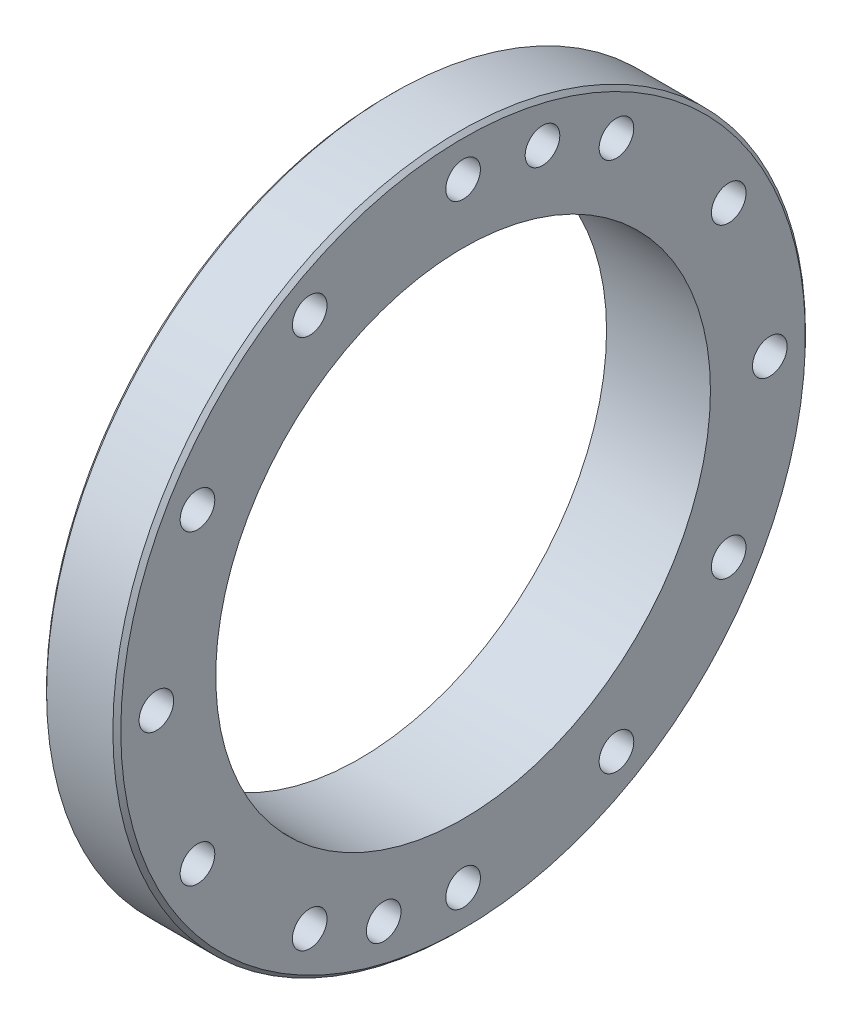
ISO-10303-21;
HEADER;
FILE_DESCRIPTION(('STEP AP214'),'2;1');
FILE_NAME('part.step','',(''),(''),'','','');
FILE_SCHEMA(('AUTOMOTIVE_DESIGN { 1 0 10303 214 1 1 1 1 }'));
ENDSEC;
DATA;
#1=APPLICATION_CONTEXT('core data for automotive mechanical design processes');
#2=APPLICATION_PROTOCOL_DEFINITION('international standard','automotive_design',2000,#1);
#3=PRODUCT_CONTEXT('',#1,'mechanical');
#4=PRODUCT('Part','Part','',(#3));
#5=PRODUCT_RELATED_PRODUCT_CATEGORY('part','',(#4));
#6=PRODUCT_DEFINITION_FORMATION('','',#4);
#7=PRODUCT_DEFINITION_CONTEXT('part definition',#1,'design');
#8=PRODUCT_DEFINITION('design','',#6,#7);
#9=PRODUCT_DEFINITION_SHAPE('','',#8);
#10=(LENGTH_UNIT() NAMED_UNIT(*) SI_UNIT(.MILLI.,.METRE.));
#11=(NAMED_UNIT(*) PLANE_ANGLE_UNIT() SI_UNIT($,.RADIAN.));
#12=(NAMED_UNIT(*) SI_UNIT($,.STERADIAN.) SOLID_ANGLE_UNIT());
#13=UNCERTAINTY_MEASURE_WITH_UNIT(LENGTH_MEASURE(1.E-05),#10,'distance_accuracy_value','');
#14=(GEOMETRIC_REPRESENTATION_CONTEXT(3) GLOBAL_UNCERTAINTY_ASSIGNED_CONTEXT((#13)) GLOBAL_UNIT_ASSIGNED_CONTEXT((#10,
#11,#12)) REPRESENTATION_CONTEXT('',''));
#15=CARTESIAN_POINT('',(0.,0.,0.));
#16=DIRECTION('',(0.,0.,1.));
#17=DIRECTION('',(1.,0.,0.));
#18=AXIS2_PLACEMENT_3D('',#15,#16,#17);
#19=CARTESIAN_POINT('',(19.894500543626,0.,0.));
#20=DIRECTION('',(1.,0.,0.));
#21=DIRECTION('',(0.,0.,-1.));
#22=AXIS2_PLACEMENT_3D('',#19,#20,#21);
#23=CYLINDRICAL_SURFACE('',#22,27.0000000000001);
#24=CARTESIAN_POINT('',(-0.300000000000002,0.,0.));
#25=DIRECTION('',(-1.,0.,0.));
#26=DIRECTION('',(0.,0.,1.));
#27=AXIS2_PLACEMENT_3D('',#24,#25,#26);
#28=CIRCLE('',#27,27.);
#29=CARTESIAN_POINT('',(-0.300000000000002,0.,27.));
#30=VERTEX_POINT('',#29);
#31=EDGE_CURVE('E111',#30,#30,#28,.T.);
#32=ORIENTED_EDGE('',*,*,#31,.T.);
#33=EDGE_LOOP('',(#32));
#34=FACE_BOUND('',#33,.T.);
#35=CARTESIAN_POINT('',(-2.59999999999996,0.,0.));
#36=DIRECTION('',(1.,0.,0.));
#37=DIRECTION('',(0.,0.,-1.));
#38=AXIS2_PLACEMENT_3D('',#35,#36,#37);
#39=CIRCLE('',#38,27.0000000000001);
#40=CARTESIAN_POINT('',(-2.59999999999996,0.,-27.0000000000001));
#41=VERTEX_POINT('',#40);
#42=EDGE_CURVE('E108',#41,#41,#39,.F.);
#43=ORIENTED_EDGE('',*,*,#42,.F.);
#44=EDGE_LOOP('',(#43));
#45=FACE_BOUND('',#44,.T.);
#46=ADVANCED_FACE('F16',(#34,#45),#23,.T.);
#47=CARTESIAN_POINT('',(7.49999999999934,-29.9437006149611,8.02339039817816));
#48=DIRECTION('',(1.,0.,0.));
#49=DIRECTION('',(0.,0.,-1.));
#50=AXIS2_PLACEMENT_3D('',#47,#48,#49);
#51=CYLINDRICAL_SURFACE('',#50,1.24999999999999);
#52=CARTESIAN_POINT('',(0.,-29.9437006149611,8.02339039817816));
#53=DIRECTION('',(1.,0.,0.));
#54=DIRECTION('',(0.,0.,-1.));
#55=AXIS2_PLACEMENT_3D('',#52,#53,#54);
#56=CIRCLE('',#55,1.24999999999999);
#57=CARTESIAN_POINT('',(0.,-29.9437006149611,6.77339039817817));
#58=VERTEX_POINT('',#57);
#59=EDGE_CURVE('E104',#58,#58,#56,.T.);
#60=ORIENTED_EDGE('',*,*,#59,.F.);
#61=EDGE_LOOP('',(#60));
#62=FACE_BOUND('',#61,.T.);
#63=CARTESIAN_POINT('',(3.6995696905251,-29.9437006149611,8.02339039817816));
#64=DIRECTION('',(1.,0.,0.));
#65=DIRECTION('',(0.,0.,-1.));
#66=AXIS2_PLACEMENT_3D('',#63,#64,#65);
#67=CIRCLE('',#66,1.25000000006885);
#68=CARTESIAN_POINT('',(3.6995696905251,-29.9437006149611,6.77339039810931));
#69=VERTEX_POINT('',#68);
#70=EDGE_CURVE('E105',#69,#69,#67,.T.);
#71=ORIENTED_EDGE('',*,*,#70,.T.);
#72=EDGE_LOOP('',(#71));
#73=FACE_BOUND('',#72,.T.);
#74=ADVANCED_FACE('F210',(#62,#73),#51,.F.);
#75=CARTESIAN_POINT('',(7.49999999999934,29.9437006149611,-8.02339039817816));
#76=DIRECTION('',(1.,0.,0.));
#77=DIRECTION('',(0.,0.,-1.));
#78=AXIS2_PLACEMENT_3D('',#75,#76,#77);
#79=CYLINDRICAL_SURFACE('',#78,1.24999999999999);
#80=CARTESIAN_POINT('',(0.,29.9437006149611,-8.02339039817816));
#81=DIRECTION('',(1.,0.,0.));
#82=DIRECTION('',(0.,0.,-1.));
#83=AXIS2_PLACEMENT_3D('',#80,#81,#82);
#84=CIRCLE('',#83,1.24999999999999);
#85=CARTESIAN_POINT('',(0.,29.9437006149611,-9.27339039817815));
#86=VERTEX_POINT('',#85);
#87=EDGE_CURVE('E204',#86,#86,#84,.T.);
#88=ORIENTED_EDGE('',*,*,#87,.F.);
#89=EDGE_LOOP('',(#88));
#90=FACE_BOUND('',#89,.T.);
#91=CARTESIAN_POINT('',(3.6995696905251,29.9437006149611,-8.02339039817816));
#92=DIRECTION('',(1.,0.,0.));
#93=DIRECTION('',(0.,0.,-1.));
#94=AXIS2_PLACEMENT_3D('',#91,#92,#93);
#95=CIRCLE('',#94,1.24999999998572);
#96=CARTESIAN_POINT('',(3.6995696905251,29.9437006149611,-9.27339039816388));
#97=VERTEX_POINT('',#96);
#98=EDGE_CURVE('E96',#97,#97,#95,.T.);
#99=ORIENTED_EDGE('',*,*,#98,.T.);
#100=EDGE_LOOP('',(#99));
#101=FACE_BOUND('',#100,.T.);
#102=ADVANCED_FACE('F87',(#90,#101),#79,.F.);
#103=CARTESIAN_POINT('',(-0.300000000000002,0.,0.));
#104=DIRECTION('',(-1.,0.,0.));
#105=DIRECTION('',(0.,0.,1.));
#106=AXIS2_PLACEMENT_3D('',#103,#104,#105);
#107=TOROIDAL_SURFACE('',#106,27.3000000000001,0.3);
#108=ORIENTED_EDGE('',*,*,#31,.F.);
#109=EDGE_LOOP('',(#108));
#110=FACE_BOUND('',#109,.T.);
#111=CARTESIAN_POINT('',(0.,0.,0.));
#112=DIRECTION('',(-1.,0.,0.));
#113=DIRECTION('',(0.,0.,-1.));
#114=AXIS2_PLACEMENT_3D('',#111,#112,#113);
#115=CIRCLE('',#114,27.3000000000001);
#116=CARTESIAN_POINT('',(0.,0.,27.3000000000001));
#117=VERTEX_POINT('',#116);
#118=CARTESIAN_POINT('',(0.,0.,-27.3000000000001));
#119=VERTEX_POINT('',#118);
#120=EDGE_CURVE('E36',#117,#119,#115,.F.);
#121=ORIENTED_EDGE('',*,*,#120,.F.);
#122=CARTESIAN_POINT('',(0.,0.,0.));
#123=DIRECTION('',(-1.,0.,0.));
#124=DIRECTION('',(0.,0.,1.));
#125=AXIS2_PLACEMENT_3D('',#122,#123,#124);
#126=CIRCLE('',#125,27.3000000000001);
#127=EDGE_CURVE('E33',#119,#117,#126,.F.);
#128=ORIENTED_EDGE('',*,*,#127,.F.);
#129=EDGE_LOOP('',(#121,#128));
#130=FACE_BOUND('',#129,.T.);
#131=ADVANCED_FACE('F37',(#110,#130),#107,.F.);
#132=CARTESIAN_POINT('',(0.399999999999985,0.,0.));
#133=DIRECTION('',(1.,0.,0.));
#134=DIRECTION('',(0.,0.,-1.));
#135=AXIS2_PLACEMENT_3D('',#132,#133,#134);
#136=CONICAL_SURFACE('',#135,35.0000000000001,0.785398163397465);
#137=CARTESIAN_POINT('',(0.399999999999984,0.,0.));
#138=DIRECTION('',(1.,0.,0.));
#139=DIRECTION('',(0.,0.,-1.));
#140=AXIS2_PLACEMENT_3D('',#137,#138,#139);
#141=CIRCLE('',#140,35.0000000000001);
#142=CARTESIAN_POINT('',(0.399999999999984,0.,-35.0000000000001));
#143=VERTEX_POINT('',#142);
#144=EDGE_CURVE('E45',#143,#143,#141,.T.);
#145=ORIENTED_EDGE('',*,*,#144,.F.);
#146=EDGE_LOOP('',(#145));
#147=FACE_BOUND('',#146,.T.);
#148=CARTESIAN_POINT('',(0.,0.,0.));
#149=DIRECTION('',(1.,0.,0.));
#150=DIRECTION('',(0.,0.,-1.));
#151=AXIS2_PLACEMENT_3D('',#148,#149,#150);
#152=CIRCLE('',#151,34.6000000000001);
#153=CARTESIAN_POINT('',(0.,0.,-34.6000000000001));
#154=VERTEX_POINT('',#153);
#155=EDGE_CURVE('E40',#154,#154,#152,.F.);
#156=ORIENTED_EDGE('',*,*,#155,.F.);
#157=EDGE_LOOP('',(#156));
#158=FACE_BOUND('',#157,.T.);
#159=ADVANCED_FACE('F79',(#147,#158),#136,.T.);
#160=CARTESIAN_POINT('',(-2.59999999999996,0.,0.));
#161=DIRECTION('',(1.,0.,0.));
#162=DIRECTION('',(0.,0.,-1.));
#163=AXIS2_PLACEMENT_3D('',#160,#161,#162);
#164=CONICAL_SURFACE('',#163,27.0000000000001,0.785398163397453);
#165=ORIENTED_EDGE('',*,*,#42,.T.);
#166=EDGE_LOOP('',(#165));
#167=FACE_BOUND('',#166,.T.);
#168=CARTESIAN_POINT('',(-2.99999999999995,0.,0.));
#169=DIRECTION('',(1.,0.,0.));
#170=DIRECTION('',(0.,0.,-1.));
#171=AXIS2_PLACEMENT_3D('',#168,#169,#170);
#172=CIRCLE('',#171,26.6000000000001);
#173=CARTESIAN_POINT('',(-2.99999999999995,0.,-26.6000000000001));
#174=VERTEX_POINT('',#173);
#175=EDGE_CURVE('E198',#174,#174,#172,.F.);
#176=ORIENTED_EDGE('',*,*,#175,.F.);
#177=EDGE_LOOP('',(#176));
#178=FACE_BOUND('',#177,.T.);
#179=ADVANCED_FACE('F75',(#167,#178),#164,.T.);
#180=CARTESIAN_POINT('',(4.0000000000191,-29.9437006149611,8.02339039817816));
#181=DIRECTION('',(1.,0.,0.));
#182=DIRECTION('',(0.,0.,-1.));
#183=AXIS2_PLACEMENT_3D('',#180,#181,#182);
#184=CONICAL_SURFACE('',#183,1.75000000000018,1.02974425864509);
#185=CARTESIAN_POINT('',(3.99999999999934,-29.9437006149611,8.02339039817816));
#186=DIRECTION('',(1.,0.,0.));
#187=DIRECTION('',(0.,0.,-1.));
#188=AXIS2_PLACEMENT_3D('',#185,#186,#187);
#189=CIRCLE('',#188,1.74999999999999);
#190=CARTESIAN_POINT('',(3.99999999999934,-29.9437006149611,6.27339039817817));
#191=VERTEX_POINT('',#190);
#192=EDGE_CURVE('E201',#191,#191,#189,.T.);
#193=ORIENTED_EDGE('',*,*,#192,.T.);
#194=EDGE_LOOP('',(#193));
#195=FACE_BOUND('',#194,.T.);
#196=ORIENTED_EDGE('',*,*,#70,.F.);
#197=EDGE_LOOP('',(#196));
#198=FACE_BOUND('',#197,.T.);
#199=ADVANCED_FACE('F71',(#195,#198),#184,.F.);
#200=CARTESIAN_POINT('',(4.0000000000191,29.9437006149611,-8.02339039817816));
#201=DIRECTION('',(1.,0.,0.));
#202=DIRECTION('',(0.,0.,-1.));
#203=AXIS2_PLACEMENT_3D('',#200,#201,#202);
#204=CONICAL_SURFACE('',#203,1.7499999999739,1.02974425869528);
#205=CARTESIAN_POINT('',(3.99999999999934,29.9437006149611,-8.02339039817816));
#206=DIRECTION('',(1.,0.,0.));
#207=DIRECTION('',(0.,0.,-1.));
#208=AXIS2_PLACEMENT_3D('',#205,#206,#207);
#209=CIRCLE('',#208,1.74999999999999);
#210=CARTESIAN_POINT('',(3.99999999999934,29.9437006149611,-9.77339039817816));
#211=VERTEX_POINT('',#210);
#212=EDGE_CURVE('E54',#211,#211,#209,.T.);
#213=ORIENTED_EDGE('',*,*,#212,.T.);
#214=EDGE_LOOP('',(#213));
#215=FACE_BOUND('',#214,.T.);
#216=ORIENTED_EDGE('',*,*,#98,.F.);
#217=EDGE_LOOP('',(#216));
#218=FACE_BOUND('',#217,.T.);
#219=ADVANCED_FACE('F66',(#215,#218),#204,.F.);
#220=CARTESIAN_POINT('',(0.,27.0000000000001,0.));
#221=DIRECTION('',(-1.,0.,0.));
#222=DIRECTION('',(0.,0.,1.));
#223=AXIS2_PLACEMENT_3D('',#220,#221,#222);
#224=PLANE('',#223);
#225=ORIENTED_EDGE('',*,*,#120,.T.);
#226=ORIENTED_EDGE('',*,*,#127,.T.);
#227=EDGE_LOOP('',(#225,#226));
#228=FACE_BOUND('',#227,.T.);
#229=ORIENTED_EDGE('',*,*,#155,.T.);
#230=EDGE_LOOP('',(#229));
#231=FACE_BOUND('',#230,.T.);
#232=CARTESIAN_POINT('',(0.,31.,0.));
#233=DIRECTION('',(1.,0.,0.));
#234=DIRECTION('',(0.,0.,-1.));
#235=AXIS2_PLACEMENT_3D('',#232,#233,#234);
#236=CIRCLE('',#235,1.74999999999999);
#237=CARTESIAN_POINT('',(0.,31.,-1.74999999999999));
#238=VERTEX_POINT('',#237);
#239=EDGE_CURVE('E162',#238,#238,#236,.T.);
#240=ORIENTED_EDGE('',*,*,#239,.T.);
#241=EDGE_LOOP('',(#240));
#242=FACE_BOUND('',#241,.T.);
#243=CARTESIAN_POINT('',(0.,26.8467875173176,15.5));
#244=DIRECTION('',(1.,0.,0.));
#245=DIRECTION('',(0.,0.,-1.));
#246=AXIS2_PLACEMENT_3D('',#243,#244,#245);
#247=CIRCLE('',#246,1.74999999999999);
#248=CARTESIAN_POINT('',(0.,26.8467875173176,13.75));
#249=VERTEX_POINT('',#248);
#250=EDGE_CURVE('E165',#249,#249,#247,.T.);
#251=ORIENTED_EDGE('',*,*,#250,.T.);
#252=EDGE_LOOP('',(#251));
#253=FACE_BOUND('',#252,.T.);
#254=CARTESIAN_POINT('',(0.,15.4999999999999,26.8467875173176));
#255=DIRECTION('',(1.,0.,0.));
#256=DIRECTION('',(0.,0.,-1.));
#257=AXIS2_PLACEMENT_3D('',#254,#255,#256);
#258=CIRCLE('',#257,1.74999999999999);
#259=CARTESIAN_POINT('',(0.,15.4999999999999,25.0967875173176));
#260=VERTEX_POINT('',#259);
#261=EDGE_CURVE('E168',#260,#260,#258,.T.);
#262=ORIENTED_EDGE('',*,*,#261,.T.);
#263=EDGE_LOOP('',(#262));
#264=FACE_BOUND('',#263,.T.);
#265=CARTESIAN_POINT('',(0.,-1.08235921504137E-13,31.));
#266=DIRECTION('',(1.,0.,0.));
#267=DIRECTION('',(0.,0.,-1.));
#268=AXIS2_PLACEMENT_3D('',#265,#266,#267);
#269=CIRCLE('',#268,1.74999999999999);
#270=CARTESIAN_POINT('',(0.,-1.08235921504137E-13,29.25));
#271=VERTEX_POINT('',#270);
#272=EDGE_CURVE('E171',#271,#271,#269,.T.);
#273=ORIENTED_EDGE('',*,*,#272,.T.);
#274=EDGE_LOOP('',(#273));
#275=FACE_BOUND('',#274,.T.);
#276=CARTESIAN_POINT('',(0.,-15.5000000000001,26.8467875173175));
#277=DIRECTION('',(1.,0.,0.));
#278=DIRECTION('',(0.,0.,-1.));
#279=AXIS2_PLACEMENT_3D('',#276,#277,#278);
#280=CIRCLE('',#279,1.74999999999999);
#281=CARTESIAN_POINT('',(0.,-15.5000000000001,25.0967875173175));
#282=VERTEX_POINT('',#281);
#283=EDGE_CURVE('E174',#282,#282,#280,.T.);
#284=ORIENTED_EDGE('',*,*,#283,.T.);
#285=EDGE_LOOP('',(#284));
#286=FACE_BOUND('',#285,.T.);
#287=CARTESIAN_POINT('',(0.,-26.8467875173177,15.4999999999998));
#288=DIRECTION('',(1.,0.,0.));
#289=DIRECTION('',(0.,0.,-1.));
#290=AXIS2_PLACEMENT_3D('',#287,#288,#289);
#291=CIRCLE('',#290,1.74999999999999);
#292=CARTESIAN_POINT('',(0.,-26.8467875173177,13.7499999999999));
#293=VERTEX_POINT('',#292);
#294=EDGE_CURVE('E177',#293,#293,#291,.T.);
#295=ORIENTED_EDGE('',*,*,#294,.T.);
#296=EDGE_LOOP('',(#295));
#297=FACE_BOUND('',#296,.T.);
#298=CARTESIAN_POINT('',(0.,-31.,0.));
#299=DIRECTION('',(1.,0.,0.));
#300=DIRECTION('',(0.,0.,-1.));
#301=AXIS2_PLACEMENT_3D('',#298,#299,#300);
#302=CIRCLE('',#301,1.74999999999999);
#303=CARTESIAN_POINT('',(0.,-31.,-1.74999999999999));
#304=VERTEX_POINT('',#303);
#305=EDGE_CURVE('E180',#304,#304,#302,.T.);
#306=ORIENTED_EDGE('',*,*,#305,.T.);
#307=EDGE_LOOP('',(#306));
#308=FACE_BOUND('',#307,.T.);
#309=CARTESIAN_POINT('',(0.,-26.8467875173175,-15.5000000000002));
#310=DIRECTION('',(1.,0.,0.));
#311=DIRECTION('',(0.,0.,-1.));
#312=AXIS2_PLACEMENT_3D('',#309,#310,#311);
#313=CIRCLE('',#312,1.74999999999999);
#314=CARTESIAN_POINT('',(0.,-26.8467875173175,-17.2500000000002));
#315=VERTEX_POINT('',#314);
#316=EDGE_CURVE('E183',#315,#315,#313,.T.);
#317=ORIENTED_EDGE('',*,*,#316,.T.);
#318=EDGE_LOOP('',(#317));
#319=FACE_BOUND('',#318,.T.);
#320=CARTESIAN_POINT('',(0.,-15.4999999999997,-26.8467875173177));
#321=DIRECTION('',(1.,0.,0.));
#322=DIRECTION('',(0.,0.,-1.));
#323=AXIS2_PLACEMENT_3D('',#320,#321,#322);
#324=CIRCLE('',#323,1.74999999999999);
#325=CARTESIAN_POINT('',(0.,-15.4999999999997,-28.5967875173177));
#326=VERTEX_POINT('',#325);
#327=EDGE_CURVE('E186',#326,#326,#324,.T.);
#328=ORIENTED_EDGE('',*,*,#327,.T.);
#329=EDGE_LOOP('',(#328));
#330=FACE_BOUND('',#329,.T.);
#331=CARTESIAN_POINT('',(0.,3.24707764512411E-13,-31.));
#332=DIRECTION('',(1.,0.,0.));
#333=DIRECTION('',(0.,0.,-1.));
#334=AXIS2_PLACEMENT_3D('',#331,#332,#333);
#335=CIRCLE('',#334,1.74999999999999);
#336=CARTESIAN_POINT('',(0.,3.24707764512411E-13,-32.75));
#337=VERTEX_POINT('',#336);
#338=EDGE_CURVE('E189',#337,#337,#335,.T.);
#339=ORIENTED_EDGE('',*,*,#338,.T.);
#340=EDGE_LOOP('',(#339));
#341=FACE_BOUND('',#340,.T.);
#342=CARTESIAN_POINT('',(0.,15.5000000000003,-26.8467875173174));
#343=DIRECTION('',(1.,0.,0.));
#344=DIRECTION('',(0.,0.,-1.));
#345=AXIS2_PLACEMENT_3D('',#342,#343,#344);
#346=CIRCLE('',#345,1.74999999999999);
#347=CARTESIAN_POINT('',(0.,15.5000000000003,-28.5967875173174));
#348=VERTEX_POINT('',#347);
#349=EDGE_CURVE('E192',#348,#348,#346,.T.);
#350=ORIENTED_EDGE('',*,*,#349,.T.);
#351=EDGE_LOOP('',(#350));
#352=FACE_BOUND('',#351,.T.);
#353=CARTESIAN_POINT('',(0.,26.8467875173178,-15.4999999999997));
#354=DIRECTION('',(1.,0.,0.));
#355=DIRECTION('',(0.,0.,-1.));
#356=AXIS2_PLACEMENT_3D('',#353,#354,#355);
#357=CIRCLE('',#356,1.74999999999999);
#358=CARTESIAN_POINT('',(0.,26.8467875173178,-17.2499999999996));
#359=VERTEX_POINT('',#358);
#360=EDGE_CURVE('E195',#359,#359,#357,.T.);
#361=ORIENTED_EDGE('',*,*,#360,.T.);
#362=EDGE_LOOP('',(#361));
#363=FACE_BOUND('',#362,.T.);
#364=ORIENTED_EDGE('',*,*,#87,.T.);
#365=EDGE_LOOP('',(#364));
#366=FACE_BOUND('',#365,.T.);
#367=ORIENTED_EDGE('',*,*,#59,.T.);
#368=EDGE_LOOP('',(#367));
#369=FACE_BOUND('',#368,.T.);
#370=ADVANCED_FACE('F43',(#228,#231,#242,#253,#264,#275,#286,#297,#308,#319,#330,#341,#352,#363,
#366,#369),#224,.T.);
#371=CARTESIAN_POINT('',(19.894500543626,0.,0.));
#372=DIRECTION('',(1.,0.,0.));
#373=DIRECTION('',(0.,0.,-1.));
#374=AXIS2_PLACEMENT_3D('',#371,#372,#373);
#375=CYLINDRICAL_SURFACE('',#374,35.0000000000001);
#376=CARTESIAN_POINT('',(7.09999999999936,0.,0.));
#377=DIRECTION('',(-1.,0.,0.));
#378=DIRECTION('',(0.,0.,1.));
#379=AXIS2_PLACEMENT_3D('',#376,#377,#378);
#380=CIRCLE('',#379,35.0000000000001);
#381=CARTESIAN_POINT('',(7.09999999999936,0.,35.0000000000001));
#382=VERTEX_POINT('',#381);
#383=EDGE_CURVE('E161',#382,#382,#380,.F.);
#384=ORIENTED_EDGE('',*,*,#383,.F.);
#385=EDGE_LOOP('',(#384));
#386=FACE_BOUND('',#385,.T.);
#387=ORIENTED_EDGE('',*,*,#144,.T.);
#388=EDGE_LOOP('',(#387));
#389=FACE_BOUND('',#388,.T.);
#390=ADVANCED_FACE('F65',(#386,#389),#375,.T.);
#391=CARTESIAN_POINT('',(-2.99999999999995,25.,0.));
#392=DIRECTION('',(-1.,0.,0.));
#393=DIRECTION('',(0.,0.,1.));
#394=AXIS2_PLACEMENT_3D('',#391,#392,#393);
#395=PLANE('',#394);
#396=CARTESIAN_POINT('',(-2.99999999999995,0.,0.));
#397=DIRECTION('',(1.,0.,0.));
#398=DIRECTION('',(0.,0.,-1.));
#399=AXIS2_PLACEMENT_3D('',#396,#397,#398);
#400=CIRCLE('',#399,25.);
#401=CARTESIAN_POINT('',(-2.99999999999995,0.,-25.));
#402=VERTEX_POINT('',#401);
#403=EDGE_CURVE('E158',#402,#402,#400,.T.);
#404=ORIENTED_EDGE('',*,*,#403,.T.);
#405=EDGE_LOOP('',(#404));
#406=FACE_BOUND('',#405,.T.);
#407=ORIENTED_EDGE('',*,*,#175,.T.);
#408=EDGE_LOOP('',(#407));
#409=FACE_BOUND('',#408,.T.);
#410=ADVANCED_FACE('F292',(#406,#409),#395,.T.);
#411=CARTESIAN_POINT('',(7.49999999999934,-29.9437006149611,8.02339039817816));
#412=DIRECTION('',(1.,0.,0.));
#413=DIRECTION('',(0.,0.,-1.));
#414=AXIS2_PLACEMENT_3D('',#411,#412,#413);
#415=CYLINDRICAL_SURFACE('',#414,1.74999999999999);
#416=CARTESIAN_POINT('',(7.49999999999934,-29.9437006149611,8.02339039817816));
#417=DIRECTION('',(1.,0.,0.));
#418=DIRECTION('',(0.,0.,-1.));
#419=AXIS2_PLACEMENT_3D('',#416,#417,#418);
#420=CIRCLE('',#419,1.74999999999999);
#421=CARTESIAN_POINT('',(7.49999999999934,-29.9437006149611,6.27339039817817));
#422=VERTEX_POINT('',#421);
#423=EDGE_CURVE('E155',#422,#422,#420,.F.);
#424=ORIENTED_EDGE('',*,*,#423,.F.);
#425=EDGE_LOOP('',(#424));
#426=FACE_BOUND('',#425,.T.);
#427=ORIENTED_EDGE('',*,*,#192,.F.);
#428=EDGE_LOOP('',(#427));
#429=FACE_BOUND('',#428,.T.);
#430=ADVANCED_FACE('F289',(#426,#429),#415,.F.);
#431=CARTESIAN_POINT('',(7.49999999999934,29.9437006149611,-8.02339039817816));
#432=DIRECTION('',(1.,0.,0.));
#433=DIRECTION('',(0.,0.,-1.));
#434=AXIS2_PLACEMENT_3D('',#431,#432,#433);
#435=CYLINDRICAL_SURFACE('',#434,1.74999999999999);
#436=CARTESIAN_POINT('',(7.49999999999934,29.9437006149611,-8.02339039817816));
#437=DIRECTION('',(1.,0.,0.));
#438=DIRECTION('',(0.,0.,-1.));
#439=AXIS2_PLACEMENT_3D('',#436,#437,#438);
#440=CIRCLE('',#439,1.74999999999999);
#441=CARTESIAN_POINT('',(7.49999999999934,29.9437006149611,-9.77339039817816));
#442=VERTEX_POINT('',#441);
#443=EDGE_CURVE('E152',#442,#442,#440,.F.);
#444=ORIENTED_EDGE('',*,*,#443,.F.);
#445=EDGE_LOOP('',(#444));
#446=FACE_BOUND('',#445,.T.);
#447=ORIENTED_EDGE('',*,*,#212,.F.);
#448=EDGE_LOOP('',(#447));
#449=FACE_BOUND('',#448,.T.);
#450=ADVANCED_FACE('F285',(#446,#449),#435,.F.);
#451=CARTESIAN_POINT('',(7.49999999999934,26.8467875173178,-15.4999999999997));
#452=DIRECTION('',(1.,0.,0.));
#453=DIRECTION('',(0.,0.,-1.));
#454=AXIS2_PLACEMENT_3D('',#451,#452,#453);
#455=CYLINDRICAL_SURFACE('',#454,1.74999999999999);
#456=CARTESIAN_POINT('',(7.49999999999934,26.8467875173178,-15.4999999999997));
#457=DIRECTION('',(1.,0.,0.));
#458=DIRECTION('',(0.,0.,-1.));
#459=AXIS2_PLACEMENT_3D('',#456,#457,#458);
#460=CIRCLE('',#459,1.74999999999999);
#461=CARTESIAN_POINT('',(7.49999999999934,26.8467875173178,-17.2499999999996));
#462=VERTEX_POINT('',#461);
#463=EDGE_CURVE('E149',#462,#462,#460,.F.);
#464=ORIENTED_EDGE('',*,*,#463,.F.);
#465=EDGE_LOOP('',(#464));
#466=FACE_BOUND('',#465,.T.);
#467=ORIENTED_EDGE('',*,*,#360,.F.);
#468=EDGE_LOOP('',(#467));
#469=FACE_BOUND('',#468,.T.);
#470=ADVANCED_FACE('F281',(#466,#469),#455,.F.);
#471=CARTESIAN_POINT('',(7.49999999999934,15.5000000000003,-26.8467875173174));
#472=DIRECTION('',(1.,0.,0.));
#473=DIRECTION('',(0.,0.,-1.));
#474=AXIS2_PLACEMENT_3D('',#471,#472,#473);
#475=CYLINDRICAL_SURFACE('',#474,1.74999999999999);
#476=CARTESIAN_POINT('',(7.49999999999934,15.5000000000003,-26.8467875173174));
#477=DIRECTION('',(1.,0.,0.));
#478=DIRECTION('',(0.,0.,-1.));
#479=AXIS2_PLACEMENT_3D('',#476,#477,#478);
#480=CIRCLE('',#479,1.74999999999999);
#481=CARTESIAN_POINT('',(7.49999999999934,15.5000000000003,-28.5967875173174));
#482=VERTEX_POINT('',#481);
#483=EDGE_CURVE('E146',#482,#482,#480,.F.);
#484=ORIENTED_EDGE('',*,*,#483,.F.);
#485=EDGE_LOOP('',(#484));
#486=FACE_BOUND('',#485,.T.);
#487=ORIENTED_EDGE('',*,*,#349,.F.);
#488=EDGE_LOOP('',(#487));
#489=FACE_BOUND('',#488,.T.);
#490=ADVANCED_FACE('F277',(#486,#489),#475,.F.);
#491=CARTESIAN_POINT('',(7.49999999999934,3.24707764512411E-13,-31.));
#492=DIRECTION('',(1.,0.,0.));
#493=DIRECTION('',(0.,0.,-1.));
#494=AXIS2_PLACEMENT_3D('',#491,#492,#493);
#495=CYLINDRICAL_SURFACE('',#494,1.74999999999999);
#496=CARTESIAN_POINT('',(7.49999999999934,3.24707764512411E-13,-31.));
#497=DIRECTION('',(1.,0.,0.));
#498=DIRECTION('',(0.,0.,-1.));
#499=AXIS2_PLACEMENT_3D('',#496,#497,#498);
#500=CIRCLE('',#499,1.74999999999999);
#501=CARTESIAN_POINT('',(7.49999999999934,3.24707764512411E-13,-32.75));
#502=VERTEX_POINT('',#501);
#503=EDGE_CURVE('E143',#502,#502,#500,.F.);
#504=ORIENTED_EDGE('',*,*,#503,.F.);
#505=EDGE_LOOP('',(#504));
#506=FACE_BOUND('',#505,.T.);
#507=ORIENTED_EDGE('',*,*,#338,.F.);
#508=EDGE_LOOP('',(#507));
#509=FACE_BOUND('',#508,.T.);
#510=ADVANCED_FACE('F273',(#506,#509),#495,.F.);
#511=CARTESIAN_POINT('',(7.49999999999934,-15.4999999999997,-26.8467875173177));
#512=DIRECTION('',(1.,0.,0.));
#513=DIRECTION('',(0.,0.,-1.));
#514=AXIS2_PLACEMENT_3D('',#511,#512,#513);
#515=CYLINDRICAL_SURFACE('',#514,1.74999999999999);
#516=CARTESIAN_POINT('',(7.49999999999934,-15.4999999999997,-26.8467875173177));
#517=DIRECTION('',(1.,0.,0.));
#518=DIRECTION('',(0.,0.,-1.));
#519=AXIS2_PLACEMENT_3D('',#516,#517,#518);
#520=CIRCLE('',#519,1.74999999999999);
#521=CARTESIAN_POINT('',(7.49999999999934,-15.4999999999997,-28.5967875173177));
#522=VERTEX_POINT('',#521);
#523=EDGE_CURVE('E140',#522,#522,#520,.F.);
#524=ORIENTED_EDGE('',*,*,#523,.F.);
#525=EDGE_LOOP('',(#524));
#526=FACE_BOUND('',#525,.T.);
#527=ORIENTED_EDGE('',*,*,#327,.F.);
#528=EDGE_LOOP('',(#527));
#529=FACE_BOUND('',#528,.T.);
#530=ADVANCED_FACE('F269',(#526,#529),#515,.F.);
#531=CARTESIAN_POINT('',(7.49999999999934,-26.8467875173175,-15.5000000000002));
#532=DIRECTION('',(1.,0.,0.));
#533=DIRECTION('',(0.,0.,-1.));
#534=AXIS2_PLACEMENT_3D('',#531,#532,#533);
#535=CYLINDRICAL_SURFACE('',#534,1.74999999999999);
#536=CARTESIAN_POINT('',(7.49999999999934,-26.8467875173175,-15.5000000000002));
#537=DIRECTION('',(1.,0.,0.));
#538=DIRECTION('',(0.,0.,-1.));
#539=AXIS2_PLACEMENT_3D('',#536,#537,#538);
#540=CIRCLE('',#539,1.74999999999999);
#541=CARTESIAN_POINT('',(7.49999999999934,-26.8467875173175,-17.2500000000002));
#542=VERTEX_POINT('',#541);
#543=EDGE_CURVE('E137',#542,#542,#540,.F.);
#544=ORIENTED_EDGE('',*,*,#543,.F.);
#545=EDGE_LOOP('',(#544));
#546=FACE_BOUND('',#545,.T.);
#547=ORIENTED_EDGE('',*,*,#316,.F.);
#548=EDGE_LOOP('',(#547));
#549=FACE_BOUND('',#548,.T.);
#550=ADVANCED_FACE('F265',(#546,#549),#535,.F.);
#551=CARTESIAN_POINT('',(7.49999999999934,-31.,0.));
#552=DIRECTION('',(1.,0.,0.));
#553=DIRECTION('',(0.,0.,-1.));
#554=AXIS2_PLACEMENT_3D('',#551,#552,#553);
#555=CYLINDRICAL_SURFACE('',#554,1.74999999999999);
#556=CARTESIAN_POINT('',(7.49999999999934,-31.,0.));
#557=DIRECTION('',(1.,0.,0.));
#558=DIRECTION('',(0.,0.,-1.));
#559=AXIS2_PLACEMENT_3D('',#556,#557,#558);
#560=CIRCLE('',#559,1.74999999999999);
#561=CARTESIAN_POINT('',(7.49999999999934,-31.,-1.74999999999999));
#562=VERTEX_POINT('',#561);
#563=EDGE_CURVE('E134',#562,#562,#560,.F.);
#564=ORIENTED_EDGE('',*,*,#563,.F.);
#565=EDGE_LOOP('',(#564));
#566=FACE_BOUND('',#565,.T.);
#567=ORIENTED_EDGE('',*,*,#305,.F.);
#568=EDGE_LOOP('',(#567));
#569=FACE_BOUND('',#568,.T.);
#570=ADVANCED_FACE('F261',(#566,#569),#555,.F.);
#571=CARTESIAN_POINT('',(7.49999999999934,-26.8467875173177,15.4999999999998));
#572=DIRECTION('',(1.,0.,0.));
#573=DIRECTION('',(0.,0.,-1.));
#574=AXIS2_PLACEMENT_3D('',#571,#572,#573);
#575=CYLINDRICAL_SURFACE('',#574,1.74999999999999);
#576=CARTESIAN_POINT('',(7.49999999999934,-26.8467875173177,15.4999999999998));
#577=DIRECTION('',(1.,0.,0.));
#578=DIRECTION('',(0.,0.,-1.));
#579=AXIS2_PLACEMENT_3D('',#576,#577,#578);
#580=CIRCLE('',#579,1.74999999999999);
#581=CARTESIAN_POINT('',(7.49999999999934,-26.8467875173177,13.7499999999999));
#582=VERTEX_POINT('',#581);
#583=EDGE_CURVE('E131',#582,#582,#580,.F.);
#584=ORIENTED_EDGE('',*,*,#583,.F.);
#585=EDGE_LOOP('',(#584));
#586=FACE_BOUND('',#585,.T.);
#587=ORIENTED_EDGE('',*,*,#294,.F.);
#588=EDGE_LOOP('',(#587));
#589=FACE_BOUND('',#588,.T.);
#590=ADVANCED_FACE('F257',(#586,#589),#575,.F.);
#591=CARTESIAN_POINT('',(7.49999999999934,-15.5000000000001,26.8467875173175));
#592=DIRECTION('',(1.,0.,0.));
#593=DIRECTION('',(0.,0.,-1.));
#594=AXIS2_PLACEMENT_3D('',#591,#592,#593);
#595=CYLINDRICAL_SURFACE('',#594,1.74999999999999);
#596=CARTESIAN_POINT('',(7.49999999999934,-15.5000000000001,26.8467875173175));
#597=DIRECTION('',(1.,0.,0.));
#598=DIRECTION('',(0.,0.,-1.));
#599=AXIS2_PLACEMENT_3D('',#596,#597,#598);
#600=CIRCLE('',#599,1.74999999999999);
#601=CARTESIAN_POINT('',(7.49999999999934,-15.5000000000001,25.0967875173175));
#602=VERTEX_POINT('',#601);
#603=EDGE_CURVE('E128',#602,#602,#600,.F.);
#604=ORIENTED_EDGE('',*,*,#603,.F.);
#605=EDGE_LOOP('',(#604));
#606=FACE_BOUND('',#605,.T.);
#607=ORIENTED_EDGE('',*,*,#283,.F.);
#608=EDGE_LOOP('',(#607));
#609=FACE_BOUND('',#608,.T.);
#610=ADVANCED_FACE('F253',(#606,#609),#595,.F.);
#611=CARTESIAN_POINT('',(7.49999999999934,-1.08235921504137E-13,31.));
#612=DIRECTION('',(1.,0.,0.));
#613=DIRECTION('',(0.,0.,-1.));
#614=AXIS2_PLACEMENT_3D('',#611,#612,#613);
#615=CYLINDRICAL_SURFACE('',#614,1.74999999999999);
#616=CARTESIAN_POINT('',(7.49999999999934,-1.08235921504137E-13,31.));
#617=DIRECTION('',(1.,0.,0.));
#618=DIRECTION('',(0.,0.,-1.));
#619=AXIS2_PLACEMENT_3D('',#616,#617,#618);
#620=CIRCLE('',#619,1.74999999999999);
#621=CARTESIAN_POINT('',(7.49999999999934,-1.08235921504137E-13,29.25));
#622=VERTEX_POINT('',#621);
#623=EDGE_CURVE('E125',#622,#622,#620,.F.);
#624=ORIENTED_EDGE('',*,*,#623,.F.);
#625=EDGE_LOOP('',(#624));
#626=FACE_BOUND('',#625,.T.);
#627=ORIENTED_EDGE('',*,*,#272,.F.);
#628=EDGE_LOOP('',(#627));
#629=FACE_BOUND('',#628,.T.);
#630=ADVANCED_FACE('F249',(#626,#629),#615,.F.);
#631=CARTESIAN_POINT('',(7.49999999999934,15.4999999999999,26.8467875173176));
#632=DIRECTION('',(1.,0.,0.));
#633=DIRECTION('',(0.,0.,-1.));
#634=AXIS2_PLACEMENT_3D('',#631,#632,#633);
#635=CYLINDRICAL_SURFACE('',#634,1.74999999999999);
#636=CARTESIAN_POINT('',(7.49999999999934,15.4999999999999,26.8467875173176));
#637=DIRECTION('',(1.,0.,0.));
#638=DIRECTION('',(0.,0.,-1.));
#639=AXIS2_PLACEMENT_3D('',#636,#637,#638);
#640=CIRCLE('',#639,1.74999999999999);
#641=CARTESIAN_POINT('',(7.49999999999934,15.4999999999999,25.0967875173176));
#642=VERTEX_POINT('',#641);
#643=EDGE_CURVE('E122',#642,#642,#640,.F.);
#644=ORIENTED_EDGE('',*,*,#643,.F.);
#645=EDGE_LOOP('',(#644));
#646=FACE_BOUND('',#645,.T.);
#647=ORIENTED_EDGE('',*,*,#261,.F.);
#648=EDGE_LOOP('',(#647));
#649=FACE_BOUND('',#648,.T.);
#650=ADVANCED_FACE('F245',(#646,#649),#635,.F.);
#651=CARTESIAN_POINT('',(7.49999999999934,26.8467875173176,15.5));
#652=DIRECTION('',(1.,0.,0.));
#653=DIRECTION('',(0.,0.,-1.));
#654=AXIS2_PLACEMENT_3D('',#651,#652,#653);
#655=CYLINDRICAL_SURFACE('',#654,1.74999999999999);
#656=CARTESIAN_POINT('',(7.49999999999934,26.8467875173176,15.5));
#657=DIRECTION('',(1.,0.,0.));
#658=DIRECTION('',(0.,0.,-1.));
#659=AXIS2_PLACEMENT_3D('',#656,#657,#658);
#660=CIRCLE('',#659,1.74999999999999);
#661=CARTESIAN_POINT('',(7.49999999999934,26.8467875173176,13.75));
#662=VERTEX_POINT('',#661);
#663=EDGE_CURVE('E119',#662,#662,#660,.F.);
#664=ORIENTED_EDGE('',*,*,#663,.F.);
#665=EDGE_LOOP('',(#664));
#666=FACE_BOUND('',#665,.T.);
#667=ORIENTED_EDGE('',*,*,#250,.F.);
#668=EDGE_LOOP('',(#667));
#669=FACE_BOUND('',#668,.T.);
#670=ADVANCED_FACE('F241',(#666,#669),#655,.F.);
#671=CARTESIAN_POINT('',(7.49999999999934,31.,0.));
#672=DIRECTION('',(1.,0.,0.));
#673=DIRECTION('',(0.,0.,-1.));
#674=AXIS2_PLACEMENT_3D('',#671,#672,#673);
#675=CYLINDRICAL_SURFACE('',#674,1.74999999999999);
#676=CARTESIAN_POINT('',(7.49999999999934,31.,0.));
#677=DIRECTION('',(1.,0.,0.));
#678=DIRECTION('',(0.,0.,-1.));
#679=AXIS2_PLACEMENT_3D('',#676,#677,#678);
#680=CIRCLE('',#679,1.74999999999999);
#681=CARTESIAN_POINT('',(7.49999999999934,31.,-1.74999999999999));
#682=VERTEX_POINT('',#681);
#683=EDGE_CURVE('E116',#682,#682,#680,.F.);
#684=ORIENTED_EDGE('',*,*,#683,.F.);
#685=EDGE_LOOP('',(#684));
#686=FACE_BOUND('',#685,.T.);
#687=ORIENTED_EDGE('',*,*,#239,.F.);
#688=EDGE_LOOP('',(#687));
#689=FACE_BOUND('',#688,.T.);
#690=ADVANCED_FACE('F237',(#686,#689),#675,.F.);
#691=CARTESIAN_POINT('',(7.09999999999936,0.,0.));
#692=DIRECTION('',(-1.,0.,0.));
#693=DIRECTION('',(0.,0.,1.));
#694=AXIS2_PLACEMENT_3D('',#691,#692,#693);
#695=CONICAL_SURFACE('',#694,35.0000000000001,0.785398163397467);
#696=ORIENTED_EDGE('',*,*,#383,.T.);
#697=EDGE_LOOP('',(#696));
#698=FACE_BOUND('',#697,.T.);
#699=CARTESIAN_POINT('',(7.49999999999934,0.,0.));
#700=DIRECTION('',(-1.,0.,0.));
#701=DIRECTION('',(0.,0.,1.));
#702=AXIS2_PLACEMENT_3D('',#699,#700,#701);
#703=CIRCLE('',#702,34.6000000000001);
#704=CARTESIAN_POINT('',(7.49999999999934,0.,34.6000000000001));
#705=VERTEX_POINT('',#704);
#706=EDGE_CURVE('E27',#705,#705,#703,.F.);
#707=ORIENTED_EDGE('',*,*,#706,.F.);
#708=EDGE_LOOP('',(#707));
#709=FACE_BOUND('',#708,.T.);
#710=ADVANCED_FACE('F230',(#698,#709),#695,.T.);
#711=CARTESIAN_POINT('',(19.894500543626,0.,0.));
#712=DIRECTION('',(1.,0.,0.));
#713=DIRECTION('',(0.,0.,-1.));
#714=AXIS2_PLACEMENT_3D('',#711,#712,#713);
#715=CYLINDRICAL_SURFACE('',#714,25.);
#716=CARTESIAN_POINT('',(7.49999999999934,0.,0.));
#717=DIRECTION('',(1.,0.,0.));
#718=DIRECTION('',(0.,0.,-1.));
#719=AXIS2_PLACEMENT_3D('',#716,#717,#718);
#720=CIRCLE('',#719,25.);
#721=CARTESIAN_POINT('',(7.49999999999934,0.,-25.));
#722=VERTEX_POINT('',#721);
#723=EDGE_CURVE('E11',#722,#722,#720,.F.);
#724=ORIENTED_EDGE('',*,*,#723,.F.);
#725=EDGE_LOOP('',(#724));
#726=FACE_BOUND('',#725,.T.);
#727=ORIENTED_EDGE('',*,*,#403,.F.);
#728=EDGE_LOOP('',(#727));
#729=FACE_BOUND('',#728,.T.);
#730=ADVANCED_FACE('F224',(#726,#729),#715,.F.);
#731=CARTESIAN_POINT('',(7.49999999999934,35.0000000000001,0.));
#732=DIRECTION('',(1.,0.,0.));
#733=DIRECTION('',(0.,0.,-1.));
#734=AXIS2_PLACEMENT_3D('',#731,#732,#733);
#735=PLANE('',#734);
#736=ORIENTED_EDGE('',*,*,#723,.T.);
#737=EDGE_LOOP('',(#736));
#738=FACE_BOUND('',#737,.T.);
#739=ORIENTED_EDGE('',*,*,#706,.T.);
#740=EDGE_LOOP('',(#739));
#741=FACE_BOUND('',#740,.T.);
#742=ORIENTED_EDGE('',*,*,#683,.T.);
#743=EDGE_LOOP('',(#742));
#744=FACE_BOUND('',#743,.T.);
#745=ORIENTED_EDGE('',*,*,#663,.T.);
#746=EDGE_LOOP('',(#745));
#747=FACE_BOUND('',#746,.T.);
#748=ORIENTED_EDGE('',*,*,#643,.T.);
#749=EDGE_LOOP('',(#748));
#750=FACE_BOUND('',#749,.T.);
#751=ORIENTED_EDGE('',*,*,#623,.T.);
#752=EDGE_LOOP('',(#751));
#753=FACE_BOUND('',#752,.T.);
#754=ORIENTED_EDGE('',*,*,#603,.T.);
#755=EDGE_LOOP('',(#754));
#756=FACE_BOUND('',#755,.T.);
#757=ORIENTED_EDGE('',*,*,#583,.T.);
#758=EDGE_LOOP('',(#757));
#759=FACE_BOUND('',#758,.T.);
#760=ORIENTED_EDGE('',*,*,#563,.T.);
#761=EDGE_LOOP('',(#760));
#762=FACE_BOUND('',#761,.T.);
#763=ORIENTED_EDGE('',*,*,#543,.T.);
#764=EDGE_LOOP('',(#763));
#765=FACE_BOUND('',#764,.T.);
#766=ORIENTED_EDGE('',*,*,#523,.T.);
#767=EDGE_LOOP('',(#766));
#768=FACE_BOUND('',#767,.T.);
#769=ORIENTED_EDGE('',*,*,#503,.T.);
#770=EDGE_LOOP('',(#769));
#771=FACE_BOUND('',#770,.T.);
#772=ORIENTED_EDGE('',*,*,#483,.T.);
#773=EDGE_LOOP('',(#772));
#774=FACE_BOUND('',#773,.T.);
#775=ORIENTED_EDGE('',*,*,#463,.T.);
#776=EDGE_LOOP('',(#775));
#777=FACE_BOUND('',#776,.T.);
#778=ORIENTED_EDGE('',*,*,#443,.T.);
#779=EDGE_LOOP('',(#778));
#780=FACE_BOUND('',#779,.T.);
#781=ORIENTED_EDGE('',*,*,#423,.T.);
#782=EDGE_LOOP('',(#781));
#783=FACE_BOUND('',#782,.T.);
#784=ADVANCED_FACE('F222',(#738,#741,#744,#747,#750,#753,#756,#759,#762,#765,#768,#771,#774,
#777,#780,#783),#735,.T.);
#785=CLOSED_SHELL('',(#46,#74,#102,#131,#159,#179,#199,#219,#370,#390,#410,#430,#450,#470,#490,
#510,#530,#550,#570,#590,#610,#630,#650,#670,#690,#710,#730,#784));
#786=MANIFOLD_SOLID_BREP('B1',#785);
#787=ADVANCED_BREP_SHAPE_REPRESENTATION('',(#18,#786),#14);
#788=SHAPE_DEFINITION_REPRESENTATION(#9,#787);
ENDSEC;
END-ISO-10303-21;
